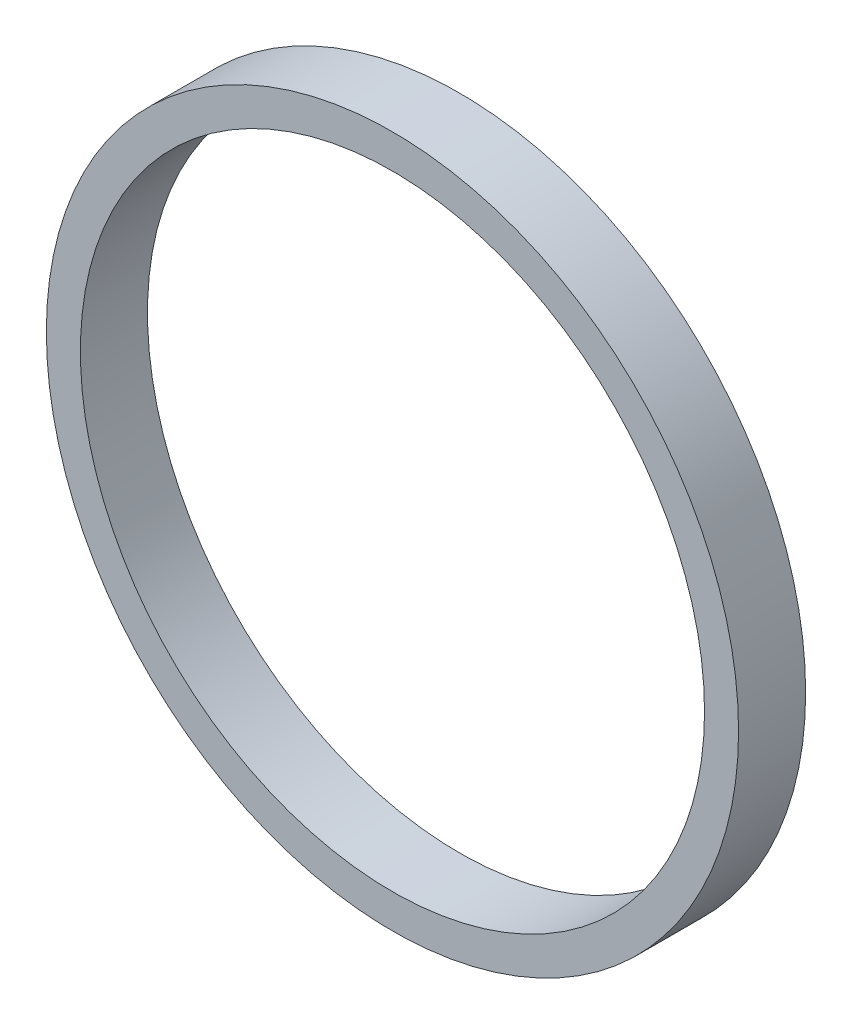
ISO-10303-21;
HEADER;
FILE_DESCRIPTION(('STEP AP214'),'2;1');
FILE_NAME('part.step','',(''),(''),'','','');
FILE_SCHEMA(('AUTOMOTIVE_DESIGN { 1 0 10303 214 1 1 1 1 }'));
ENDSEC;
DATA;
#1=APPLICATION_CONTEXT('core data for automotive mechanical design processes');
#2=APPLICATION_PROTOCOL_DEFINITION('international standard','automotive_design',2000,#1);
#3=PRODUCT_CONTEXT('',#1,'mechanical');
#4=PRODUCT('Part','Part','',(#3));
#5=PRODUCT_RELATED_PRODUCT_CATEGORY('part','',(#4));
#6=PRODUCT_DEFINITION_FORMATION('','',#4);
#7=PRODUCT_DEFINITION_CONTEXT('part definition',#1,'design');
#8=PRODUCT_DEFINITION('design','',#6,#7);
#9=PRODUCT_DEFINITION_SHAPE('','',#8);
#10=(LENGTH_UNIT() NAMED_UNIT(*) SI_UNIT(.MILLI.,.METRE.));
#11=(NAMED_UNIT(*) PLANE_ANGLE_UNIT() SI_UNIT($,.RADIAN.));
#12=(NAMED_UNIT(*) SI_UNIT($,.STERADIAN.) SOLID_ANGLE_UNIT());
#13=UNCERTAINTY_MEASURE_WITH_UNIT(LENGTH_MEASURE(1.E-05),#10,'distance_accuracy_value','');
#14=(GEOMETRIC_REPRESENTATION_CONTEXT(3) GLOBAL_UNCERTAINTY_ASSIGNED_CONTEXT((#13)) GLOBAL_UNIT_ASSIGNED_CONTEXT((#10,
#11,#12)) REPRESENTATION_CONTEXT('',''));
#15=CARTESIAN_POINT('',(0.,0.,0.));
#16=DIRECTION('',(0.,0.,1.));
#17=DIRECTION('',(1.,0.,0.));
#18=AXIS2_PLACEMENT_3D('',#15,#16,#17);
#19=CARTESIAN_POINT('',(0.,25.05,2.6924));
#20=DIRECTION('',(0.,0.,-1.));
#21=DIRECTION('',(-1.,0.,0.));
#22=AXIS2_PLACEMENT_3D('',#19,#20,#21);
#23=PLANE('',#22);
#24=CARTESIAN_POINT('',(0.,0.,2.6924));
#25=DIRECTION('',(0.,0.,1.));
#26=DIRECTION('',(1.,0.,0.));
#27=AXIS2_PLACEMENT_3D('',#24,#25,#26);
#28=CIRCLE('',#27,25.05);
#29=CARTESIAN_POINT('',(25.05,0.,2.6924));
#30=VERTEX_POINT('',#29);
#31=EDGE_CURVE('E46',#30,#30,#28,.T.);
#32=ORIENTED_EDGE('',*,*,#31,.F.);
#33=EDGE_LOOP('',(#32));
#34=FACE_BOUND('',#33,.T.);
#35=CARTESIAN_POINT('',(0.,0.,2.6924));
#36=DIRECTION('',(0.,0.,1.));
#37=DIRECTION('',(1.,0.,0.));
#38=AXIS2_PLACEMENT_3D('',#35,#36,#37);
#39=CIRCLE('',#38,27.78125);
#40=CARTESIAN_POINT('',(27.78125,0.,2.6924));
#41=VERTEX_POINT('',#40);
#42=EDGE_CURVE('E10',#41,#41,#39,.T.);
#43=ORIENTED_EDGE('',*,*,#42,.T.);
#44=EDGE_LOOP('',(#43));
#45=FACE_BOUND('',#44,.T.);
#46=ADVANCED_FACE('F32',(#34,#45),#23,.F.);
#47=CARTESIAN_POINT('',(0.,0.,35.6270308501065));
#48=DIRECTION('',(0.,0.,1.));
#49=DIRECTION('',(1.,0.,0.));
#50=AXIS2_PLACEMENT_3D('',#47,#48,#49);
#51=CYLINDRICAL_SURFACE('',#50,27.78125);
#52=ORIENTED_EDGE('',*,*,#42,.F.);
#53=EDGE_LOOP('',(#52));
#54=FACE_BOUND('',#53,.T.);
#55=CARTESIAN_POINT('',(0.,0.,-2.6924));
#56=DIRECTION('',(0.,0.,1.));
#57=DIRECTION('',(1.,0.,0.));
#58=AXIS2_PLACEMENT_3D('',#55,#56,#57);
#59=CIRCLE('',#58,27.78125);
#60=CARTESIAN_POINT('',(27.78125,0.,-2.6924));
#61=VERTEX_POINT('',#60);
#62=EDGE_CURVE('E38',#61,#61,#59,.T.);
#63=ORIENTED_EDGE('',*,*,#62,.T.);
#64=EDGE_LOOP('',(#63));
#65=FACE_BOUND('',#64,.T.);
#66=ADVANCED_FACE('F55',(#54,#65),#51,.T.);
#67=CARTESIAN_POINT('',(0.,25.05,-2.6924));
#68=DIRECTION('',(0.,0.,1.));
#69=DIRECTION('',(1.,0.,0.));
#70=AXIS2_PLACEMENT_3D('',#67,#68,#69);
#71=PLANE('',#70);
#72=ORIENTED_EDGE('',*,*,#62,.F.);
#73=EDGE_LOOP('',(#72));
#74=FACE_BOUND('',#73,.T.);
#75=CARTESIAN_POINT('',(0.,0.,-2.6924));
#76=DIRECTION('',(0.,0.,1.));
#77=DIRECTION('',(1.,0.,0.));
#78=AXIS2_PLACEMENT_3D('',#75,#76,#77);
#79=CIRCLE('',#78,25.05);
#80=CARTESIAN_POINT('',(25.05,0.,-2.6924));
#81=VERTEX_POINT('',#80);
#82=EDGE_CURVE('E42',#81,#81,#79,.T.);
#83=ORIENTED_EDGE('',*,*,#82,.T.);
#84=EDGE_LOOP('',(#83));
#85=FACE_BOUND('',#84,.T.);
#86=ADVANCED_FACE('F59',(#74,#85),#71,.F.);
#87=CARTESIAN_POINT('',(0.,0.,35.6270308501065));
#88=DIRECTION('',(0.,0.,1.));
#89=DIRECTION('',(1.,0.,0.));
#90=AXIS2_PLACEMENT_3D('',#87,#88,#89);
#91=CYLINDRICAL_SURFACE('',#90,25.05);
#92=ORIENTED_EDGE('',*,*,#82,.F.);
#93=EDGE_LOOP('',(#92));
#94=FACE_BOUND('',#93,.T.);
#95=ORIENTED_EDGE('',*,*,#31,.T.);
#96=EDGE_LOOP('',(#95));
#97=FACE_BOUND('',#96,.T.);
#98=ADVANCED_FACE('F52',(#94,#97),#91,.F.);
#99=CLOSED_SHELL('',(#46,#66,#86,#98));
#100=MANIFOLD_SOLID_BREP('B2',#99);
#101=ADVANCED_BREP_SHAPE_REPRESENTATION('',(#18,#100),#14);
#102=SHAPE_DEFINITION_REPRESENTATION(#9,#101);
ENDSEC;
END-ISO-10303-21;
